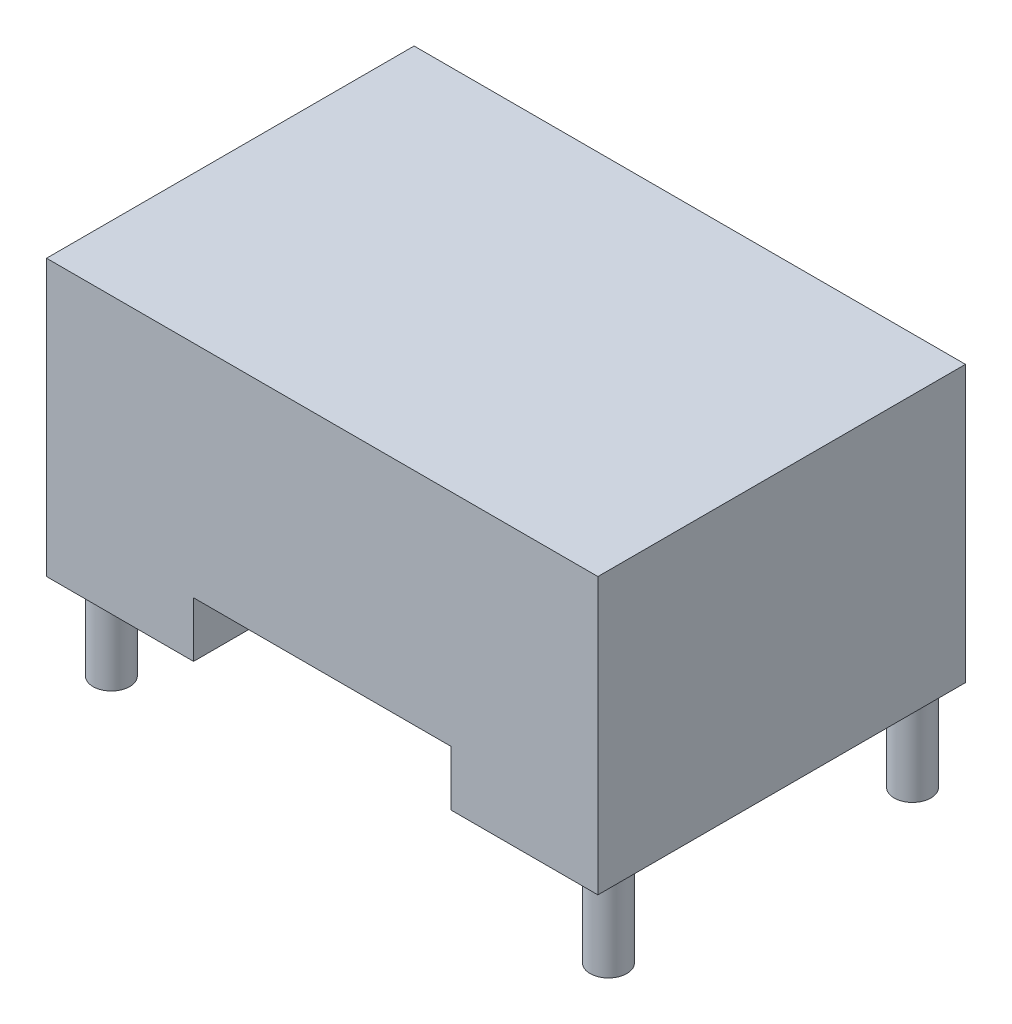
ISO-10303-21;
HEADER;
FILE_DESCRIPTION(('STEP AP214'),'2;1');
FILE_NAME('part.step','',(''),(''),'','','');
FILE_SCHEMA(('AUTOMOTIVE_DESIGN { 1 0 10303 214 1 1 1 1 }'));
ENDSEC;
DATA;
#1=APPLICATION_CONTEXT('core data for automotive mechanical design processes');
#2=APPLICATION_PROTOCOL_DEFINITION('international standard','automotive_design',2000,#1);
#3=PRODUCT_CONTEXT('',#1,'mechanical');
#4=PRODUCT('Part','Part','',(#3));
#5=PRODUCT_RELATED_PRODUCT_CATEGORY('part','',(#4));
#6=PRODUCT_DEFINITION_FORMATION('','',#4);
#7=PRODUCT_DEFINITION_CONTEXT('part definition',#1,'design');
#8=PRODUCT_DEFINITION('design','',#6,#7);
#9=PRODUCT_DEFINITION_SHAPE('','',#8);
#10=(LENGTH_UNIT() NAMED_UNIT(*) SI_UNIT(.MILLI.,.METRE.));
#11=(NAMED_UNIT(*) PLANE_ANGLE_UNIT() SI_UNIT($,.RADIAN.));
#12=(NAMED_UNIT(*) SI_UNIT($,.STERADIAN.) SOLID_ANGLE_UNIT());
#13=UNCERTAINTY_MEASURE_WITH_UNIT(LENGTH_MEASURE(1.E-05),#10,'distance_accuracy_value','');
#14=(GEOMETRIC_REPRESENTATION_CONTEXT(3) GLOBAL_UNCERTAINTY_ASSIGNED_CONTEXT((#13)) GLOBAL_UNIT_ASSIGNED_CONTEXT((#10,
#11,#12)) REPRESENTATION_CONTEXT('',''));
#15=CARTESIAN_POINT('',(0.,0.,0.));
#16=DIRECTION('',(0.,0.,1.));
#17=DIRECTION('',(1.,0.,0.));
#18=AXIS2_PLACEMENT_3D('',#15,#16,#17);
#19=CARTESIAN_POINT('',(-1500.,1500.,-1000.));
#20=DIRECTION('',(0.,0.,1.));
#21=DIRECTION('',(1.,0.,0.));
#22=AXIS2_PLACEMENT_3D('',#19,#20,#21);
#23=PLANE('',#22);
#24=DIRECTION('',(0.,-1.,0.));
#25=VECTOR('',#24,1.);
#26=CARTESIAN_POINT('',(700.,1500.,-1000.));
#27=LINE('',#26,#25);
#28=CARTESIAN_POINT('',(700.,300.,-1000.));
#29=VERTEX_POINT('',#28);
#30=CARTESIAN_POINT('',(700.,0.,-1000.));
#31=VERTEX_POINT('',#30);
#32=EDGE_CURVE('E151',#29,#31,#27,.T.);
#33=ORIENTED_EDGE('',*,*,#32,.F.);
#34=DIRECTION('',(-1.,0.,0.));
#35=VECTOR('',#34,1.);
#36=CARTESIAN_POINT('',(-1500.,300.,-1000.));
#37=LINE('',#36,#35);
#38=CARTESIAN_POINT('',(-700.,300.,-1000.));
#39=VERTEX_POINT('',#38);
#40=EDGE_CURVE('E121',#29,#39,#37,.T.);
#41=ORIENTED_EDGE('',*,*,#40,.T.);
#42=DIRECTION('',(0.,1.,0.));
#43=VECTOR('',#42,1.);
#44=CARTESIAN_POINT('',(-700.,1500.,-1000.));
#45=LINE('',#44,#43);
#46=CARTESIAN_POINT('',(-700.,0.,-1000.));
#47=VERTEX_POINT('',#46);
#48=EDGE_CURVE('E109',#47,#39,#45,.T.);
#49=ORIENTED_EDGE('',*,*,#48,.F.);
#50=DIRECTION('',(-1.,0.,0.));
#51=VECTOR('',#50,1.);
#52=CARTESIAN_POINT('',(-1500.,0.,-1000.));
#53=LINE('',#52,#51);
#54=CARTESIAN_POINT('',(-1500.,0.,-1000.));
#55=VERTEX_POINT('',#54);
#56=EDGE_CURVE('E119',#47,#55,#53,.T.);
#57=ORIENTED_EDGE('',*,*,#56,.T.);
#58=DIRECTION('',(0.,-1.,0.));
#59=VECTOR('',#58,1.);
#60=CARTESIAN_POINT('',(-1500.,1500.,-1000.));
#61=LINE('',#60,#59);
#62=CARTESIAN_POINT('',(-1500.,1500.,-1000.));
#63=VERTEX_POINT('',#62);
#64=EDGE_CURVE('E144',#63,#55,#61,.T.);
#65=ORIENTED_EDGE('',*,*,#64,.F.);
#66=DIRECTION('',(-1.,0.,0.));
#67=VECTOR('',#66,1.);
#68=CARTESIAN_POINT('',(-1500.,1500.,-1000.));
#69=LINE('',#68,#67);
#70=CARTESIAN_POINT('',(1500.,1500.,-1000.));
#71=VERTEX_POINT('',#70);
#72=EDGE_CURVE('E86',#71,#63,#69,.T.);
#73=ORIENTED_EDGE('',*,*,#72,.F.);
#74=DIRECTION('',(0.,-1.,0.));
#75=VECTOR('',#74,1.);
#76=CARTESIAN_POINT('',(1500.,1500.,-1000.));
#77=LINE('',#76,#75);
#78=CARTESIAN_POINT('',(1500.,0.,-1000.));
#79=VERTEX_POINT('',#78);
#80=EDGE_CURVE('E115',#71,#79,#77,.T.);
#81=ORIENTED_EDGE('',*,*,#80,.T.);
#82=EDGE_CURVE('E127',#79,#31,#53,.T.);
#83=ORIENTED_EDGE('',*,*,#82,.T.);
#84=EDGE_LOOP('',(#33,#41,#49,#57,#65,#73,#81,#83));
#85=FACE_BOUND('',#84,.T.);
#86=ADVANCED_FACE('F33',(#85),#23,.F.);
#87=CARTESIAN_POINT('',(-1500.,1500.,1000.));
#88=DIRECTION('',(0.,0.,-1.));
#89=DIRECTION('',(-1.,0.,0.));
#90=AXIS2_PLACEMENT_3D('',#87,#88,#89);
#91=PLANE('',#90);
#92=DIRECTION('',(0.,1.,0.));
#93=VECTOR('',#92,1.);
#94=CARTESIAN_POINT('',(700.,1500.,1000.));
#95=LINE('',#94,#93);
#96=CARTESIAN_POINT('',(700.,0.,1000.));
#97=VERTEX_POINT('',#96);
#98=CARTESIAN_POINT('',(700.,300.,1000.));
#99=VERTEX_POINT('',#98);
#100=EDGE_CURVE('E122',#97,#99,#95,.T.);
#101=ORIENTED_EDGE('',*,*,#100,.F.);
#102=DIRECTION('',(1.,0.,0.));
#103=VECTOR('',#102,1.);
#104=CARTESIAN_POINT('',(-1500.,0.,1000.));
#105=LINE('',#104,#103);
#106=CARTESIAN_POINT('',(1500.,0.,1000.));
#107=VERTEX_POINT('',#106);
#108=EDGE_CURVE('E78',#97,#107,#105,.T.);
#109=ORIENTED_EDGE('',*,*,#108,.T.);
#110=DIRECTION('',(0.,-1.,0.));
#111=VECTOR('',#110,1.);
#112=CARTESIAN_POINT('',(1500.,1500.,1000.));
#113=LINE('',#112,#111);
#114=CARTESIAN_POINT('',(1500.,1500.,1000.));
#115=VERTEX_POINT('',#114);
#116=EDGE_CURVE('E139',#115,#107,#113,.T.);
#117=ORIENTED_EDGE('',*,*,#116,.F.);
#118=DIRECTION('',(1.,0.,0.));
#119=VECTOR('',#118,1.);
#120=CARTESIAN_POINT('',(-1500.,1500.,1000.));
#121=LINE('',#120,#119);
#122=CARTESIAN_POINT('',(-1500.,1500.,1000.));
#123=VERTEX_POINT('',#122);
#124=EDGE_CURVE('E57',#123,#115,#121,.T.);
#125=ORIENTED_EDGE('',*,*,#124,.F.);
#126=DIRECTION('',(0.,-1.,0.));
#127=VECTOR('',#126,1.);
#128=CARTESIAN_POINT('',(-1500.,1500.,1000.));
#129=LINE('',#128,#127);
#130=CARTESIAN_POINT('',(-1500.,0.,1000.));
#131=VERTEX_POINT('',#130);
#132=EDGE_CURVE('E141',#123,#131,#129,.T.);
#133=ORIENTED_EDGE('',*,*,#132,.T.);
#134=CARTESIAN_POINT('',(-700.,0.,1000.));
#135=VERTEX_POINT('',#134);
#136=EDGE_CURVE('E136',#131,#135,#105,.T.);
#137=ORIENTED_EDGE('',*,*,#136,.T.);
#138=DIRECTION('',(0.,-1.,0.));
#139=VECTOR('',#138,1.);
#140=CARTESIAN_POINT('',(-700.,1500.,1000.));
#141=LINE('',#140,#139);
#142=CARTESIAN_POINT('',(-700.,300.,1000.));
#143=VERTEX_POINT('',#142);
#144=EDGE_CURVE('E48',#143,#135,#141,.T.);
#145=ORIENTED_EDGE('',*,*,#144,.F.);
#146=DIRECTION('',(1.,0.,0.));
#147=VECTOR('',#146,1.);
#148=CARTESIAN_POINT('',(-1500.,300.,1000.));
#149=LINE('',#148,#147);
#150=EDGE_CURVE('E11',#143,#99,#149,.T.);
#151=ORIENTED_EDGE('',*,*,#150,.T.);
#152=EDGE_LOOP('',(#101,#109,#117,#125,#133,#137,#145,#151));
#153=FACE_BOUND('',#152,.T.);
#154=ADVANCED_FACE('F153',(#153),#91,.F.);
#155=CARTESIAN_POINT('',(0.,0.,0.));
#156=DIRECTION('',(0.,1.,0.));
#157=DIRECTION('',(0.,0.,1.));
#158=AXIS2_PLACEMENT_3D('',#155,#156,#157);
#159=PLANE('',#158);
#160=CARTESIAN_POINT('',(1349.83387026904,0.,792.363091909272));
#161=DIRECTION('',(0.,1.,0.));
#162=DIRECTION('',(0.,0.,1.));
#163=AXIS2_PLACEMENT_3D('',#160,#161,#162);
#164=CIRCLE('',#163,100.);
#165=CARTESIAN_POINT('',(1349.83387026904,0.,892.363091909272));
#166=VERTEX_POINT('',#165);
#167=EDGE_CURVE('E186',#166,#166,#164,.T.);
#168=ORIENTED_EDGE('',*,*,#167,.T.);
#169=EDGE_LOOP('',(#168));
#170=FACE_BOUND('',#169,.T.);
#171=CARTESIAN_POINT('',(1349.83387026904,0.,-862.12017261708));
#172=DIRECTION('',(0.,1.,0.));
#173=DIRECTION('',(0.,0.,1.));
#174=AXIS2_PLACEMENT_3D('',#171,#172,#173);
#175=CIRCLE('',#174,100.);
#176=CARTESIAN_POINT('',(1349.83387026904,0.,-762.12017261708));
#177=VERTEX_POINT('',#176);
#178=EDGE_CURVE('E180',#177,#177,#175,.T.);
#179=ORIENTED_EDGE('',*,*,#178,.T.);
#180=EDGE_LOOP('',(#179));
#181=FACE_BOUND('',#180,.T.);
#182=DIRECTION('',(0.,0.,1.));
#183=VECTOR('',#182,1.);
#184=CARTESIAN_POINT('',(700.,0.,0.));
#185=LINE('',#184,#183);
#186=EDGE_CURVE('E41',#31,#97,#185,.T.);
#187=ORIENTED_EDGE('',*,*,#186,.F.);
#188=ORIENTED_EDGE('',*,*,#82,.F.);
#189=DIRECTION('',(0.,0.,-1.));
#190=VECTOR('',#189,1.);
#191=CARTESIAN_POINT('',(1500.,0.,-1000.));
#192=LINE('',#191,#190);
#193=EDGE_CURVE('E128',#107,#79,#192,.T.);
#194=ORIENTED_EDGE('',*,*,#193,.F.);
#195=ORIENTED_EDGE('',*,*,#108,.F.);
#196=EDGE_LOOP('',(#187,#188,#194,#195));
#197=FACE_BOUND('',#196,.T.);
#198=ADVANCED_FACE('F156',(#170,#181,#197),#159,.F.);
#199=CARTESIAN_POINT('',(-1354.76027125542,0.,792.363091909272));
#200=DIRECTION('',(0.,1.,0.));
#201=DIRECTION('',(0.,0.,1.));
#202=AXIS2_PLACEMENT_3D('',#199,#200,#201);
#203=CIRCLE('',#202,100.);
#204=CARTESIAN_POINT('',(-1354.76027125542,0.,892.363091909272));
#205=VERTEX_POINT('',#204);
#206=EDGE_CURVE('E192',#205,#205,#203,.T.);
#207=ORIENTED_EDGE('',*,*,#206,.T.);
#208=EDGE_LOOP('',(#207));
#209=FACE_BOUND('',#208,.T.);
#210=CARTESIAN_POINT('',(-1354.76027125542,0.,-862.12017261708));
#211=DIRECTION('',(0.,1.,0.));
#212=DIRECTION('',(0.,0.,1.));
#213=AXIS2_PLACEMENT_3D('',#210,#211,#212);
#214=CIRCLE('',#213,100.);
#215=CARTESIAN_POINT('',(-1354.76027125542,0.,-762.12017261708));
#216=VERTEX_POINT('',#215);
#217=EDGE_CURVE('E174',#216,#216,#214,.T.);
#218=ORIENTED_EDGE('',*,*,#217,.T.);
#219=EDGE_LOOP('',(#218));
#220=FACE_BOUND('',#219,.T.);
#221=DIRECTION('',(0.,0.,-1.));
#222=VECTOR('',#221,1.);
#223=CARTESIAN_POINT('',(-700.,0.,0.));
#224=LINE('',#223,#222);
#225=EDGE_CURVE('E106',#135,#47,#224,.T.);
#226=ORIENTED_EDGE('',*,*,#225,.F.);
#227=ORIENTED_EDGE('',*,*,#136,.F.);
#228=DIRECTION('',(0.,0.,1.));
#229=VECTOR('',#228,1.);
#230=CARTESIAN_POINT('',(-1500.,0.,-1000.));
#231=LINE('',#230,#229);
#232=EDGE_CURVE('E126',#55,#131,#231,.T.);
#233=ORIENTED_EDGE('',*,*,#232,.F.);
#234=ORIENTED_EDGE('',*,*,#56,.F.);
#235=EDGE_LOOP('',(#226,#227,#233,#234));
#236=FACE_BOUND('',#235,.T.);
#237=ADVANCED_FACE('F125',(#209,#220,#236),#159,.F.);
#238=CARTESIAN_POINT('',(1500.,1500.,-1000.));
#239=DIRECTION('',(-1.,0.,0.));
#240=DIRECTION('',(0.,0.,1.));
#241=AXIS2_PLACEMENT_3D('',#238,#239,#240);
#242=PLANE('',#241);
#243=ORIENTED_EDGE('',*,*,#193,.T.);
#244=ORIENTED_EDGE('',*,*,#80,.F.);
#245=DIRECTION('',(0.,0.,-1.));
#246=VECTOR('',#245,1.);
#247=CARTESIAN_POINT('',(1500.,1500.,-1000.));
#248=LINE('',#247,#246);
#249=EDGE_CURVE('E138',#115,#71,#248,.T.);
#250=ORIENTED_EDGE('',*,*,#249,.F.);
#251=ORIENTED_EDGE('',*,*,#116,.T.);
#252=EDGE_LOOP('',(#243,#244,#250,#251));
#253=FACE_BOUND('',#252,.T.);
#254=ADVANCED_FACE('F35',(#253),#242,.F.);
#255=CARTESIAN_POINT('',(-1500.,1500.,-1000.));
#256=DIRECTION('',(1.,0.,0.));
#257=DIRECTION('',(0.,0.,-1.));
#258=AXIS2_PLACEMENT_3D('',#255,#256,#257);
#259=PLANE('',#258);
#260=ORIENTED_EDGE('',*,*,#232,.T.);
#261=ORIENTED_EDGE('',*,*,#132,.F.);
#262=DIRECTION('',(0.,0.,1.));
#263=VECTOR('',#262,1.);
#264=CARTESIAN_POINT('',(-1500.,1500.,-1000.));
#265=LINE('',#264,#263);
#266=EDGE_CURVE('E161',#63,#123,#265,.T.);
#267=ORIENTED_EDGE('',*,*,#266,.F.);
#268=ORIENTED_EDGE('',*,*,#64,.T.);
#269=EDGE_LOOP('',(#260,#261,#267,#268));
#270=FACE_BOUND('',#269,.T.);
#271=ADVANCED_FACE('F215',(#270),#259,.F.);
#272=CARTESIAN_POINT('',(0.,1500.,0.));
#273=DIRECTION('',(0.,1.,0.));
#274=DIRECTION('',(0.,0.,1.));
#275=AXIS2_PLACEMENT_3D('',#272,#273,#274);
#276=PLANE('',#275);
#277=ORIENTED_EDGE('',*,*,#249,.T.);
#278=ORIENTED_EDGE('',*,*,#72,.T.);
#279=ORIENTED_EDGE('',*,*,#266,.T.);
#280=ORIENTED_EDGE('',*,*,#124,.T.);
#281=EDGE_LOOP('',(#277,#278,#279,#280));
#282=FACE_BOUND('',#281,.T.);
#283=ADVANCED_FACE('F217',(#282),#276,.T.);
#284=CARTESIAN_POINT('',(0.,300.,0.));
#285=DIRECTION('',(0.,1.,0.));
#286=DIRECTION('',(0.,0.,1.));
#287=AXIS2_PLACEMENT_3D('',#284,#285,#286);
#288=PLANE('',#287);
#289=DIRECTION('',(0.,0.,-1.));
#290=VECTOR('',#289,1.);
#291=CARTESIAN_POINT('',(700.,300.,-1200.));
#292=LINE('',#291,#290);
#293=EDGE_CURVE('E171',#99,#29,#292,.T.);
#294=ORIENTED_EDGE('',*,*,#293,.F.);
#295=ORIENTED_EDGE('',*,*,#150,.F.);
#296=DIRECTION('',(0.,0.,1.));
#297=VECTOR('',#296,1.);
#298=CARTESIAN_POINT('',(-700.,300.,-1200.));
#299=LINE('',#298,#297);
#300=EDGE_CURVE('E169',#39,#143,#299,.T.);
#301=ORIENTED_EDGE('',*,*,#300,.F.);
#302=ORIENTED_EDGE('',*,*,#40,.F.);
#303=EDGE_LOOP('',(#294,#295,#301,#302));
#304=FACE_BOUND('',#303,.T.);
#305=ADVANCED_FACE('F225',(#304),#288,.F.);
#306=CARTESIAN_POINT('',(700.,300.,-1200.));
#307=DIRECTION('',(-1.,0.,0.));
#308=DIRECTION('',(0.,0.,1.));
#309=AXIS2_PLACEMENT_3D('',#306,#307,#308);
#310=PLANE('',#309);
#311=ORIENTED_EDGE('',*,*,#32,.T.);
#312=ORIENTED_EDGE('',*,*,#186,.T.);
#313=ORIENTED_EDGE('',*,*,#100,.T.);
#314=ORIENTED_EDGE('',*,*,#293,.T.);
#315=EDGE_LOOP('',(#311,#312,#313,#314));
#316=FACE_BOUND('',#315,.T.);
#317=ADVANCED_FACE('F148',(#316),#310,.T.);
#318=CARTESIAN_POINT('',(-700.,300.,-1200.));
#319=DIRECTION('',(1.,0.,0.));
#320=DIRECTION('',(0.,0.,-1.));
#321=AXIS2_PLACEMENT_3D('',#318,#319,#320);
#322=PLANE('',#321);
#323=ORIENTED_EDGE('',*,*,#48,.T.);
#324=ORIENTED_EDGE('',*,*,#300,.T.);
#325=ORIENTED_EDGE('',*,*,#144,.T.);
#326=ORIENTED_EDGE('',*,*,#225,.T.);
#327=EDGE_LOOP('',(#323,#324,#325,#326));
#328=FACE_BOUND('',#327,.T.);
#329=ADVANCED_FACE('F108',(#328),#322,.T.);
#330=CARTESIAN_POINT('',(-1354.76027125542,-500.,-862.12017261708));
#331=DIRECTION('',(0.,1.,0.));
#332=DIRECTION('',(0.,0.,1.));
#333=AXIS2_PLACEMENT_3D('',#330,#331,#332);
#334=CYLINDRICAL_SURFACE('',#333,100.);
#335=CARTESIAN_POINT('',(-1354.76027125542,-500.,-862.12017261708));
#336=DIRECTION('',(0.,1.,0.));
#337=DIRECTION('',(0.,0.,1.));
#338=AXIS2_PLACEMENT_3D('',#335,#336,#337);
#339=CIRCLE('',#338,100.);
#340=CARTESIAN_POINT('',(-1354.76027125542,-500.,-762.12017261708));
#341=VERTEX_POINT('',#340);
#342=EDGE_CURVE('E173',#341,#341,#339,.T.);
#343=ORIENTED_EDGE('',*,*,#342,.T.);
#344=EDGE_LOOP('',(#343));
#345=FACE_BOUND('',#344,.T.);
#346=ORIENTED_EDGE('',*,*,#217,.F.);
#347=EDGE_LOOP('',(#346));
#348=FACE_BOUND('',#347,.T.);
#349=ADVANCED_FACE('F230',(#345,#348),#334,.T.);
#350=CARTESIAN_POINT('',(-1354.76027125542,-500.,-862.12017261708));
#351=DIRECTION('',(0.,1.,0.));
#352=DIRECTION('',(0.,0.,1.));
#353=AXIS2_PLACEMENT_3D('',#350,#351,#352);
#354=PLANE('',#353);
#355=ORIENTED_EDGE('',*,*,#342,.F.);
#356=EDGE_LOOP('',(#355));
#357=FACE_BOUND('',#356,.T.);
#358=ADVANCED_FACE('F236',(#357),#354,.F.);
#359=CARTESIAN_POINT('',(1349.83387026904,-500.,-862.12017261708));
#360=DIRECTION('',(0.,1.,0.));
#361=DIRECTION('',(0.,0.,1.));
#362=AXIS2_PLACEMENT_3D('',#359,#360,#361);
#363=CYLINDRICAL_SURFACE('',#362,100.);
#364=CARTESIAN_POINT('',(1349.83387026904,-500.,-862.12017261708));
#365=DIRECTION('',(0.,1.,0.));
#366=DIRECTION('',(0.,0.,1.));
#367=AXIS2_PLACEMENT_3D('',#364,#365,#366);
#368=CIRCLE('',#367,100.);
#369=CARTESIAN_POINT('',(1349.83387026904,-500.,-762.12017261708));
#370=VERTEX_POINT('',#369);
#371=EDGE_CURVE('E177',#370,#370,#368,.T.);
#372=ORIENTED_EDGE('',*,*,#371,.T.);
#373=EDGE_LOOP('',(#372));
#374=FACE_BOUND('',#373,.T.);
#375=ORIENTED_EDGE('',*,*,#178,.F.);
#376=EDGE_LOOP('',(#375));
#377=FACE_BOUND('',#376,.T.);
#378=ADVANCED_FACE('F240',(#374,#377),#363,.T.);
#379=CARTESIAN_POINT('',(1349.83387026904,-500.,-862.12017261708));
#380=DIRECTION('',(0.,1.,0.));
#381=DIRECTION('',(0.,0.,1.));
#382=AXIS2_PLACEMENT_3D('',#379,#380,#381);
#383=PLANE('',#382);
#384=ORIENTED_EDGE('',*,*,#371,.F.);
#385=EDGE_LOOP('',(#384));
#386=FACE_BOUND('',#385,.T.);
#387=ADVANCED_FACE('F244',(#386),#383,.F.);
#388=CARTESIAN_POINT('',(1349.83387026904,-500.,792.363091909272));
#389=DIRECTION('',(0.,1.,0.));
#390=DIRECTION('',(0.,0.,1.));
#391=AXIS2_PLACEMENT_3D('',#388,#389,#390);
#392=CYLINDRICAL_SURFACE('',#391,100.);
#393=CARTESIAN_POINT('',(1349.83387026904,-500.,792.363091909272));
#394=DIRECTION('',(0.,1.,0.));
#395=DIRECTION('',(0.,0.,1.));
#396=AXIS2_PLACEMENT_3D('',#393,#394,#395);
#397=CIRCLE('',#396,100.);
#398=CARTESIAN_POINT('',(1349.83387026904,-500.,892.363091909272));
#399=VERTEX_POINT('',#398);
#400=EDGE_CURVE('E183',#399,#399,#397,.T.);
#401=ORIENTED_EDGE('',*,*,#400,.T.);
#402=EDGE_LOOP('',(#401));
#403=FACE_BOUND('',#402,.T.);
#404=ORIENTED_EDGE('',*,*,#167,.F.);
#405=EDGE_LOOP('',(#404));
#406=FACE_BOUND('',#405,.T.);
#407=ADVANCED_FACE('F248',(#403,#406),#392,.T.);
#408=CARTESIAN_POINT('',(1349.83387026904,-500.,792.363091909272));
#409=DIRECTION('',(0.,1.,0.));
#410=DIRECTION('',(0.,0.,1.));
#411=AXIS2_PLACEMENT_3D('',#408,#409,#410);
#412=PLANE('',#411);
#413=ORIENTED_EDGE('',*,*,#400,.F.);
#414=EDGE_LOOP('',(#413));
#415=FACE_BOUND('',#414,.T.);
#416=ADVANCED_FACE('F207',(#415),#412,.F.);
#417=CARTESIAN_POINT('',(-1354.76027125542,-500.,792.363091909272));
#418=DIRECTION('',(0.,1.,0.));
#419=DIRECTION('',(0.,0.,1.));
#420=AXIS2_PLACEMENT_3D('',#417,#418,#419);
#421=CYLINDRICAL_SURFACE('',#420,100.);
#422=CARTESIAN_POINT('',(-1354.76027125542,-500.,792.363091909272));
#423=DIRECTION('',(0.,1.,0.));
#424=DIRECTION('',(0.,0.,1.));
#425=AXIS2_PLACEMENT_3D('',#422,#423,#424);
#426=CIRCLE('',#425,100.);
#427=CARTESIAN_POINT('',(-1354.76027125542,-500.,892.363091909272));
#428=VERTEX_POINT('',#427);
#429=EDGE_CURVE('E189',#428,#428,#426,.T.);
#430=ORIENTED_EDGE('',*,*,#429,.T.);
#431=EDGE_LOOP('',(#430));
#432=FACE_BOUND('',#431,.T.);
#433=ORIENTED_EDGE('',*,*,#206,.F.);
#434=EDGE_LOOP('',(#433));
#435=FACE_BOUND('',#434,.T.);
#436=ADVANCED_FACE('F198',(#432,#435),#421,.T.);
#437=CARTESIAN_POINT('',(-1354.76027125542,-500.,792.363091909272));
#438=DIRECTION('',(0.,1.,0.));
#439=DIRECTION('',(0.,0.,1.));
#440=AXIS2_PLACEMENT_3D('',#437,#438,#439);
#441=PLANE('',#440);
#442=ORIENTED_EDGE('',*,*,#429,.F.);
#443=EDGE_LOOP('',(#442));
#444=FACE_BOUND('',#443,.T.);
#445=ADVANCED_FACE('F201',(#444),#441,.F.);
#446=CLOSED_SHELL('',(#86,#154,#198,#237,#254,#271,#283,#305,#317,#329,#349,#358,#378,#387,#407,
#416,#436,#445));
#447=MANIFOLD_SOLID_BREP('B2',#446);
#448=ADVANCED_BREP_SHAPE_REPRESENTATION('',(#18,#447),#14);
#449=SHAPE_DEFINITION_REPRESENTATION(#9,#448);
ENDSEC;
END-ISO-10303-21;
